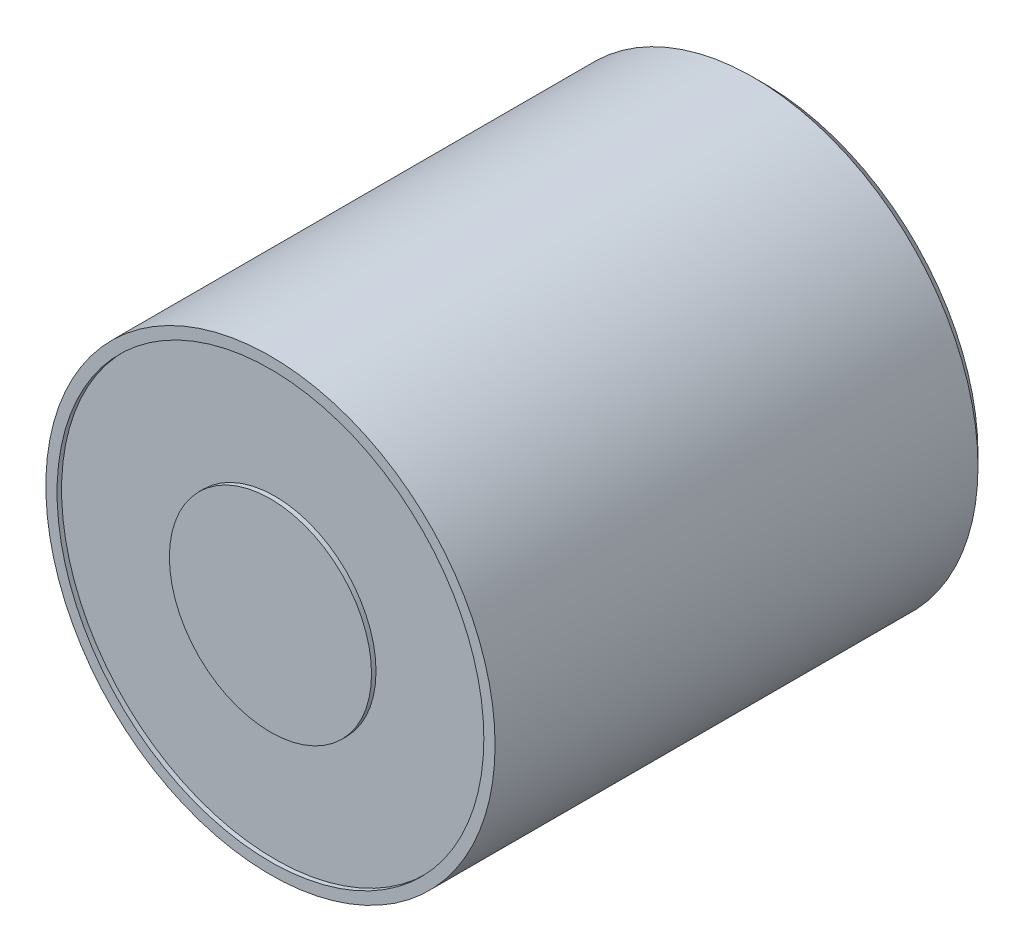
ISO-10303-21;
HEADER;
FILE_DESCRIPTION(('STEP AP214'),'2;1');
FILE_NAME('part.step','',(''),(''),'','','');
FILE_SCHEMA(('AUTOMOTIVE_DESIGN { 1 0 10303 214 1 1 1 1 }'));
ENDSEC;
DATA;
#1=APPLICATION_CONTEXT('core data for automotive mechanical design processes');
#2=APPLICATION_PROTOCOL_DEFINITION('international standard','automotive_design',2000,#1);
#3=PRODUCT_CONTEXT('',#1,'mechanical');
#4=PRODUCT('Part','Part','',(#3));
#5=PRODUCT_RELATED_PRODUCT_CATEGORY('part','',(#4));
#6=PRODUCT_DEFINITION_FORMATION('','',#4);
#7=PRODUCT_DEFINITION_CONTEXT('part definition',#1,'design');
#8=PRODUCT_DEFINITION('design','',#6,#7);
#9=PRODUCT_DEFINITION_SHAPE('','',#8);
#10=(LENGTH_UNIT() NAMED_UNIT(*) SI_UNIT(.MILLI.,.METRE.));
#11=(NAMED_UNIT(*) PLANE_ANGLE_UNIT() SI_UNIT($,.RADIAN.));
#12=(NAMED_UNIT(*) SI_UNIT($,.STERADIAN.) SOLID_ANGLE_UNIT());
#13=UNCERTAINTY_MEASURE_WITH_UNIT(LENGTH_MEASURE(1.E-05),#10,'distance_accuracy_value','');
#14=(GEOMETRIC_REPRESENTATION_CONTEXT(3) GLOBAL_UNCERTAINTY_ASSIGNED_CONTEXT((#13)) GLOBAL_UNIT_ASSIGNED_CONTEXT((#10,
#11,#12)) REPRESENTATION_CONTEXT('',''));
#15=CARTESIAN_POINT('',(0.,0.,0.));
#16=DIRECTION('',(0.,0.,1.));
#17=DIRECTION('',(1.,0.,0.));
#18=AXIS2_PLACEMENT_3D('',#15,#16,#17);
#19=CARTESIAN_POINT('',(0.,0.,22.));
#20=DIRECTION('',(0.,0.,-1.));
#21=DIRECTION('',(-1.,0.,0.));
#22=AXIS2_PLACEMENT_3D('',#19,#20,#21);
#23=CYLINDRICAL_SURFACE('',#22,10.);
#24=CARTESIAN_POINT('',(0.,0.,0.5));
#25=DIRECTION('',(0.,0.,1.));
#26=DIRECTION('',(1.,0.,0.));
#27=AXIS2_PLACEMENT_3D('',#24,#25,#26);
#28=CIRCLE('',#27,10.);
#29=CARTESIAN_POINT('',(10.,0.,0.5));
#30=VERTEX_POINT('',#29);
#31=EDGE_CURVE('E43',#30,#30,#28,.T.);
#32=ORIENTED_EDGE('',*,*,#31,.T.);
#33=EDGE_LOOP('',(#32));
#34=FACE_BOUND('',#33,.T.);
#35=CARTESIAN_POINT('',(0.,0.,22.));
#36=DIRECTION('',(0.,0.,1.));
#37=DIRECTION('',(1.,0.,0.));
#38=AXIS2_PLACEMENT_3D('',#35,#36,#37);
#39=CIRCLE('',#38,10.);
#40=CARTESIAN_POINT('',(10.,0.,22.));
#41=VERTEX_POINT('',#40);
#42=EDGE_CURVE('E71',#41,#41,#39,.T.);
#43=ORIENTED_EDGE('',*,*,#42,.F.);
#44=EDGE_LOOP('',(#43));
#45=FACE_BOUND('',#44,.T.);
#46=ADVANCED_FACE('F36',(#34,#45),#23,.T.);
#47=CARTESIAN_POINT('',(0.,0.,22.));
#48=DIRECTION('',(0.,0.,1.));
#49=DIRECTION('',(1.,0.,0.));
#50=AXIS2_PLACEMENT_3D('',#47,#48,#49);
#51=PLANE('',#50);
#52=CARTESIAN_POINT('',(0.,0.,22.));
#53=DIRECTION('',(0.,0.,1.));
#54=DIRECTION('',(1.,0.,0.));
#55=AXIS2_PLACEMENT_3D('',#52,#53,#54);
#56=CIRCLE('',#55,9.5);
#57=CARTESIAN_POINT('',(9.5,0.,22.));
#58=VERTEX_POINT('',#57);
#59=EDGE_CURVE('E66',#58,#58,#56,.T.);
#60=ORIENTED_EDGE('',*,*,#59,.F.);
#61=EDGE_LOOP('',(#60));
#62=FACE_BOUND('',#61,.T.);
#63=ORIENTED_EDGE('',*,*,#42,.T.);
#64=EDGE_LOOP('',(#63));
#65=FACE_BOUND('',#64,.T.);
#66=ADVANCED_FACE('F88',(#62,#65),#51,.T.);
#67=CARTESIAN_POINT('',(0.,0.,0.));
#68=DIRECTION('',(0.,0.,1.));
#69=DIRECTION('',(1.,0.,0.));
#70=AXIS2_PLACEMENT_3D('',#67,#68,#69);
#71=PLANE('',#70);
#72=CARTESIAN_POINT('',(0.,0.,0.));
#73=DIRECTION('',(0.,0.,1.));
#74=DIRECTION('',(1.,0.,0.));
#75=AXIS2_PLACEMENT_3D('',#72,#73,#74);
#76=CIRCLE('',#75,9.5);
#77=CARTESIAN_POINT('',(9.5,0.,0.));
#78=VERTEX_POINT('',#77);
#79=EDGE_CURVE('E11',#78,#78,#76,.F.);
#80=ORIENTED_EDGE('',*,*,#79,.T.);
#81=EDGE_LOOP('',(#80));
#82=FACE_BOUND('',#81,.T.);
#83=CARTESIAN_POINT('',(0.,0.,0.));
#84=DIRECTION('',(0.,0.,-1.));
#85=DIRECTION('',(-1.,0.,0.));
#86=AXIS2_PLACEMENT_3D('',#83,#84,#85);
#87=CIRCLE('',#86,1.65);
#88=CARTESIAN_POINT('',(-1.65,0.,0.));
#89=VERTEX_POINT('',#88);
#90=EDGE_CURVE('E57',#89,#89,#87,.T.);
#91=ORIENTED_EDGE('',*,*,#90,.F.);
#92=EDGE_LOOP('',(#91));
#93=FACE_BOUND('',#92,.T.);
#94=ADVANCED_FACE('F92',(#82,#93),#71,.F.);
#95=CARTESIAN_POINT('',(0.,0.,21.8));
#96=DIRECTION('',(0.,0.,1.));
#97=DIRECTION('',(1.,0.,0.));
#98=AXIS2_PLACEMENT_3D('',#95,#96,#97);
#99=CYLINDRICAL_SURFACE('',#98,9.5);
#100=CARTESIAN_POINT('',(0.,0.,21.8));
#101=DIRECTION('',(0.,0.,1.));
#102=DIRECTION('',(1.,0.,0.));
#103=AXIS2_PLACEMENT_3D('',#100,#101,#102);
#104=CIRCLE('',#103,9.5);
#105=CARTESIAN_POINT('',(9.5,0.,21.8));
#106=VERTEX_POINT('',#105);
#107=EDGE_CURVE('E68',#106,#106,#104,.T.);
#108=ORIENTED_EDGE('',*,*,#107,.F.);
#109=EDGE_LOOP('',(#108));
#110=FACE_BOUND('',#109,.T.);
#111=ORIENTED_EDGE('',*,*,#59,.T.);
#112=EDGE_LOOP('',(#111));
#113=FACE_BOUND('',#112,.T.);
#114=ADVANCED_FACE('F97',(#110,#113),#99,.F.);
#115=CARTESIAN_POINT('',(0.,0.,21.8));
#116=DIRECTION('',(0.,0.,1.));
#117=DIRECTION('',(1.,0.,0.));
#118=AXIS2_PLACEMENT_3D('',#115,#116,#117);
#119=PLANE('',#118);
#120=CARTESIAN_POINT('',(0.,0.,21.8));
#121=DIRECTION('',(0.,0.,1.));
#122=DIRECTION('',(1.,0.,0.));
#123=AXIS2_PLACEMENT_3D('',#120,#121,#122);
#124=CIRCLE('',#123,4.5);
#125=CARTESIAN_POINT('',(4.5,0.,21.8));
#126=VERTEX_POINT('',#125);
#127=EDGE_CURVE('E60',#126,#126,#124,.T.);
#128=ORIENTED_EDGE('',*,*,#127,.F.);
#129=EDGE_LOOP('',(#128));
#130=FACE_BOUND('',#129,.T.);
#131=ORIENTED_EDGE('',*,*,#107,.T.);
#132=EDGE_LOOP('',(#131));
#133=FACE_BOUND('',#132,.T.);
#134=ADVANCED_FACE('F102',(#130,#133),#119,.T.);
#135=CARTESIAN_POINT('',(0.,0.,21.8));
#136=DIRECTION('',(0.,0.,1.));
#137=DIRECTION('',(1.,0.,0.));
#138=AXIS2_PLACEMENT_3D('',#135,#136,#137);
#139=CYLINDRICAL_SURFACE('',#138,4.5);
#140=ORIENTED_EDGE('',*,*,#127,.T.);
#141=EDGE_LOOP('',(#140));
#142=FACE_BOUND('',#141,.T.);
#143=CARTESIAN_POINT('',(0.,0.,22.));
#144=DIRECTION('',(0.,0.,1.));
#145=DIRECTION('',(1.,0.,0.));
#146=AXIS2_PLACEMENT_3D('',#143,#144,#145);
#147=CIRCLE('',#146,4.5);
#148=CARTESIAN_POINT('',(4.5,0.,22.));
#149=VERTEX_POINT('',#148);
#150=EDGE_CURVE('E56',#149,#149,#147,.T.);
#151=ORIENTED_EDGE('',*,*,#150,.F.);
#152=EDGE_LOOP('',(#151));
#153=FACE_BOUND('',#152,.T.);
#154=ADVANCED_FACE('F106',(#142,#153),#139,.T.);
#155=ORIENTED_EDGE('',*,*,#150,.T.);
#156=EDGE_LOOP('',(#155));
#157=FACE_BOUND('',#156,.T.);
#158=ADVANCED_FACE('F50',(#157),#51,.T.);
#159=CARTESIAN_POINT('',(0.,0.,5.));
#160=DIRECTION('',(0.,0.,-1.));
#161=DIRECTION('',(-1.,0.,0.));
#162=AXIS2_PLACEMENT_3D('',#159,#160,#161);
#163=CONICAL_SURFACE('',#162,1.65,1.02974425867665);
#164=CARTESIAN_POINT('',(0.,0.,5.99142002139547));
#165=VERTEX_POINT('',#164);
#166=VERTEX_LOOP('',#165);
#167=FACE_BOUND('',#166,.T.);
#168=CARTESIAN_POINT('',(0.,0.,5.));
#169=DIRECTION('',(0.,0.,-1.));
#170=DIRECTION('',(-1.,0.,0.));
#171=AXIS2_PLACEMENT_3D('',#168,#169,#170);
#172=CIRCLE('',#171,1.65);
#173=CARTESIAN_POINT('',(-1.65,0.,5.));
#174=VERTEX_POINT('',#173);
#175=EDGE_CURVE('E54',#174,#174,#172,.T.);
#176=ORIENTED_EDGE('',*,*,#175,.T.);
#177=EDGE_LOOP('',(#176));
#178=FACE_BOUND('',#177,.T.);
#179=ADVANCED_FACE('F46',(#167,#178),#163,.F.);
#180=CARTESIAN_POINT('',(0.,0.,0.));
#181=DIRECTION('',(0.,0.,-1.));
#182=DIRECTION('',(-1.,0.,0.));
#183=AXIS2_PLACEMENT_3D('',#180,#181,#182);
#184=CYLINDRICAL_SURFACE('',#183,1.65);
#185=ORIENTED_EDGE('',*,*,#175,.F.);
#186=EDGE_LOOP('',(#185));
#187=FACE_BOUND('',#186,.T.);
#188=ORIENTED_EDGE('',*,*,#90,.T.);
#189=EDGE_LOOP('',(#188));
#190=FACE_BOUND('',#189,.T.);
#191=ADVANCED_FACE('F49',(#187,#190),#184,.F.);
#192=CARTESIAN_POINT('',(0.,0.,0.5));
#193=DIRECTION('',(0.,0.,1.));
#194=DIRECTION('',(1.,0.,0.));
#195=AXIS2_PLACEMENT_3D('',#192,#193,#194);
#196=CONICAL_SURFACE('',#195,10.,0.78539816339745);
#197=ORIENTED_EDGE('',*,*,#79,.F.);
#198=EDGE_LOOP('',(#197));
#199=FACE_BOUND('',#198,.T.);
#200=ORIENTED_EDGE('',*,*,#31,.F.);
#201=EDGE_LOOP('',(#200));
#202=FACE_BOUND('',#201,.T.);
#203=ADVANCED_FACE('F38',(#199,#202),#196,.T.);
#204=CLOSED_SHELL('',(#46,#66,#94,#114,#134,#154,#158,#179,#191,#203));
#205=MANIFOLD_SOLID_BREP('B2',#204);
#206=ADVANCED_BREP_SHAPE_REPRESENTATION('',(#18,#205),#14);
#207=SHAPE_DEFINITION_REPRESENTATION(#9,#206);
ENDSEC;
END-ISO-10303-21;
